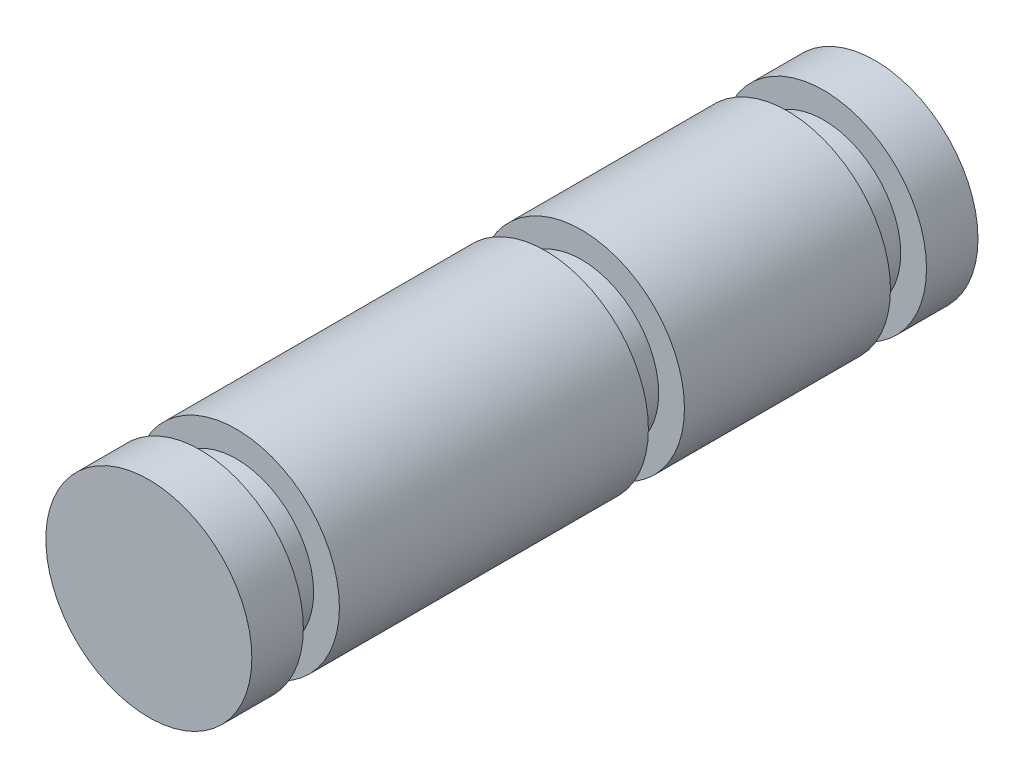
ISO-10303-21;
HEADER;
FILE_DESCRIPTION(('STEP AP214'),'2;1');
FILE_NAME('part.step','',(''),(''),'','','');
FILE_SCHEMA(('AUTOMOTIVE_DESIGN { 1 0 10303 214 1 1 1 1 }'));
ENDSEC;
DATA;
#1=APPLICATION_CONTEXT('core data for automotive mechanical design processes');
#2=APPLICATION_PROTOCOL_DEFINITION('international standard','automotive_design',2000,#1);
#3=PRODUCT_CONTEXT('',#1,'mechanical');
#4=PRODUCT('Part','Part','',(#3));
#5=PRODUCT_RELATED_PRODUCT_CATEGORY('part','',(#4));
#6=PRODUCT_DEFINITION_FORMATION('','',#4);
#7=PRODUCT_DEFINITION_CONTEXT('part definition',#1,'design');
#8=PRODUCT_DEFINITION('design','',#6,#7);
#9=PRODUCT_DEFINITION_SHAPE('','',#8);
#10=(LENGTH_UNIT() NAMED_UNIT(*) SI_UNIT(.MILLI.,.METRE.));
#11=(NAMED_UNIT(*) PLANE_ANGLE_UNIT() SI_UNIT($,.RADIAN.));
#12=(NAMED_UNIT(*) SI_UNIT($,.STERADIAN.) SOLID_ANGLE_UNIT());
#13=UNCERTAINTY_MEASURE_WITH_UNIT(LENGTH_MEASURE(1.E-05),#10,'distance_accuracy_value','');
#14=(GEOMETRIC_REPRESENTATION_CONTEXT(3) GLOBAL_UNCERTAINTY_ASSIGNED_CONTEXT((#13)) GLOBAL_UNIT_ASSIGNED_CONTEXT((#10,
#11,#12)) REPRESENTATION_CONTEXT('',''));
#15=CARTESIAN_POINT('',(0.,0.,0.));
#16=DIRECTION('',(0.,0.,1.));
#17=DIRECTION('',(1.,0.,0.));
#18=AXIS2_PLACEMENT_3D('',#15,#16,#17);
#19=CARTESIAN_POINT('',(0.,0.,12.4));
#20=DIRECTION('',(0.,0.,1.));
#21=DIRECTION('',(1.,0.,0.));
#22=AXIS2_PLACEMENT_3D('',#19,#20,#21);
#23=PLANE('',#22);
#24=CARTESIAN_POINT('',(0.,0.,12.4));
#25=DIRECTION('',(0.,0.,1.));
#26=DIRECTION('',(1.,0.,0.));
#27=AXIS2_PLACEMENT_3D('',#24,#25,#26);
#28=CIRCLE('',#27,2.);
#29=CARTESIAN_POINT('',(2.,0.,12.4));
#30=VERTEX_POINT('',#29);
#31=EDGE_CURVE('E60',#30,#30,#28,.T.);
#32=ORIENTED_EDGE('',*,*,#31,.T.);
#33=EDGE_LOOP('',(#32));
#34=FACE_BOUND('',#33,.T.);
#35=CARTESIAN_POINT('',(0.,0.,12.4));
#36=DIRECTION('',(0.,0.,1.));
#37=DIRECTION('',(1.,0.,0.));
#38=AXIS2_PLACEMENT_3D('',#35,#36,#37);
#39=CIRCLE('',#38,1.5);
#40=CARTESIAN_POINT('',(1.5,0.,12.4));
#41=VERTEX_POINT('',#40);
#42=EDGE_CURVE('E69',#41,#41,#39,.T.);
#43=ORIENTED_EDGE('',*,*,#42,.F.);
#44=EDGE_LOOP('',(#43));
#45=FACE_BOUND('',#44,.T.);
#46=ADVANCED_FACE('F32',(#34,#45),#23,.T.);
#47=CARTESIAN_POINT('',(0.,0.,5.7));
#48=DIRECTION('',(0.,0.,1.));
#49=DIRECTION('',(1.,0.,0.));
#50=AXIS2_PLACEMENT_3D('',#47,#48,#49);
#51=PLANE('',#50);
#52=CARTESIAN_POINT('',(0.,0.,5.7));
#53=DIRECTION('',(0.,0.,1.));
#54=DIRECTION('',(1.,0.,0.));
#55=AXIS2_PLACEMENT_3D('',#52,#53,#54);
#56=CIRCLE('',#55,2.);
#57=CARTESIAN_POINT('',(2.,0.,5.7));
#58=VERTEX_POINT('',#57);
#59=EDGE_CURVE('E48',#58,#58,#56,.T.);
#60=ORIENTED_EDGE('',*,*,#59,.T.);
#61=EDGE_LOOP('',(#60));
#62=FACE_BOUND('',#61,.T.);
#63=CARTESIAN_POINT('',(0.,0.,5.7));
#64=DIRECTION('',(0.,0.,1.));
#65=DIRECTION('',(1.,0.,0.));
#66=AXIS2_PLACEMENT_3D('',#63,#64,#65);
#67=CIRCLE('',#66,1.5);
#68=CARTESIAN_POINT('',(1.5,0.,5.7));
#69=VERTEX_POINT('',#68);
#70=EDGE_CURVE('E57',#69,#69,#67,.T.);
#71=ORIENTED_EDGE('',*,*,#70,.F.);
#72=EDGE_LOOP('',(#71));
#73=FACE_BOUND('',#72,.T.);
#74=ADVANCED_FACE('F103',(#62,#73),#51,.T.);
#75=CARTESIAN_POINT('',(0.,0.,1.));
#76=DIRECTION('',(0.,0.,1.));
#77=DIRECTION('',(1.,0.,0.));
#78=AXIS2_PLACEMENT_3D('',#75,#76,#77);
#79=PLANE('',#78);
#80=CARTESIAN_POINT('',(0.,0.,1.));
#81=DIRECTION('',(0.,0.,1.));
#82=DIRECTION('',(1.,0.,0.));
#83=AXIS2_PLACEMENT_3D('',#80,#81,#82);
#84=CIRCLE('',#83,2.);
#85=CARTESIAN_POINT('',(2.,0.,1.));
#86=VERTEX_POINT('',#85);
#87=EDGE_CURVE('E10',#86,#86,#84,.T.);
#88=ORIENTED_EDGE('',*,*,#87,.T.);
#89=EDGE_LOOP('',(#88));
#90=FACE_BOUND('',#89,.T.);
#91=CARTESIAN_POINT('',(0.,0.,1.));
#92=DIRECTION('',(0.,0.,1.));
#93=DIRECTION('',(1.,0.,0.));
#94=AXIS2_PLACEMENT_3D('',#91,#92,#93);
#95=CIRCLE('',#94,1.5);
#96=CARTESIAN_POINT('',(1.5,0.,1.));
#97=VERTEX_POINT('',#96);
#98=EDGE_CURVE('E45',#97,#97,#95,.T.);
#99=ORIENTED_EDGE('',*,*,#98,.F.);
#100=EDGE_LOOP('',(#99));
#101=FACE_BOUND('',#100,.T.);
#102=ADVANCED_FACE('F109',(#90,#101),#79,.T.);
#103=CARTESIAN_POINT('',(0.,0.,1.));
#104=DIRECTION('',(0.,0.,-1.));
#105=DIRECTION('',(-1.,0.,0.));
#106=AXIS2_PLACEMENT_3D('',#103,#104,#105);
#107=CYLINDRICAL_SURFACE('',#106,2.);
#108=ORIENTED_EDGE('',*,*,#87,.F.);
#109=EDGE_LOOP('',(#108));
#110=FACE_BOUND('',#109,.T.);
#111=CARTESIAN_POINT('',(0.,0.,0.));
#112=DIRECTION('',(0.,0.,1.));
#113=DIRECTION('',(1.,0.,0.));
#114=AXIS2_PLACEMENT_3D('',#111,#112,#113);
#115=CIRCLE('',#114,2.);
#116=CARTESIAN_POINT('',(2.,0.,0.));
#117=VERTEX_POINT('',#116);
#118=EDGE_CURVE('E36',#117,#117,#115,.T.);
#119=ORIENTED_EDGE('',*,*,#118,.T.);
#120=EDGE_LOOP('',(#119));
#121=FACE_BOUND('',#120,.T.);
#122=ADVANCED_FACE('F34',(#110,#121),#107,.T.);
#123=CARTESIAN_POINT('',(0.,0.,0.));
#124=DIRECTION('',(0.,0.,1.));
#125=DIRECTION('',(1.,0.,0.));
#126=AXIS2_PLACEMENT_3D('',#123,#124,#125);
#127=PLANE('',#126);
#128=ORIENTED_EDGE('',*,*,#118,.F.);
#129=EDGE_LOOP('',(#128));
#130=FACE_BOUND('',#129,.T.);
#131=ADVANCED_FACE('F135',(#130),#127,.F.);
#132=CARTESIAN_POINT('',(0.,0.,1.7));
#133=DIRECTION('',(0.,0.,-1.));
#134=DIRECTION('',(-1.,0.,0.));
#135=AXIS2_PLACEMENT_3D('',#132,#133,#134);
#136=CYLINDRICAL_SURFACE('',#135,1.5);
#137=CARTESIAN_POINT('',(0.,0.,1.7));
#138=DIRECTION('',(0.,0.,1.));
#139=DIRECTION('',(1.,0.,0.));
#140=AXIS2_PLACEMENT_3D('',#137,#138,#139);
#141=CIRCLE('',#140,1.5);
#142=CARTESIAN_POINT('',(1.5,0.,1.7));
#143=VERTEX_POINT('',#142);
#144=EDGE_CURVE('E43',#143,#143,#141,.T.);
#145=ORIENTED_EDGE('',*,*,#144,.F.);
#146=EDGE_LOOP('',(#145));
#147=FACE_BOUND('',#146,.T.);
#148=ORIENTED_EDGE('',*,*,#98,.T.);
#149=EDGE_LOOP('',(#148));
#150=FACE_BOUND('',#149,.T.);
#151=ADVANCED_FACE('F128',(#147,#150),#136,.T.);
#152=CARTESIAN_POINT('',(0.,0.,1.7));
#153=DIRECTION('',(0.,0.,1.));
#154=DIRECTION('',(1.,0.,0.));
#155=AXIS2_PLACEMENT_3D('',#152,#153,#154);
#156=PLANE('',#155);
#157=CARTESIAN_POINT('',(0.,0.,1.7));
#158=DIRECTION('',(0.,0.,1.));
#159=DIRECTION('',(1.,0.,0.));
#160=AXIS2_PLACEMENT_3D('',#157,#158,#159);
#161=CIRCLE('',#160,2.);
#162=CARTESIAN_POINT('',(2.,0.,1.7));
#163=VERTEX_POINT('',#162);
#164=EDGE_CURVE('E51',#163,#163,#161,.T.);
#165=ORIENTED_EDGE('',*,*,#164,.F.);
#166=EDGE_LOOP('',(#165));
#167=FACE_BOUND('',#166,.T.);
#168=ORIENTED_EDGE('',*,*,#144,.T.);
#169=EDGE_LOOP('',(#168));
#170=FACE_BOUND('',#169,.T.);
#171=ADVANCED_FACE('F125',(#167,#170),#156,.F.);
#172=CARTESIAN_POINT('',(0.,0.,5.7));
#173=DIRECTION('',(0.,0.,-1.));
#174=DIRECTION('',(-1.,0.,0.));
#175=AXIS2_PLACEMENT_3D('',#172,#173,#174);
#176=CYLINDRICAL_SURFACE('',#175,2.);
#177=ORIENTED_EDGE('',*,*,#59,.F.);
#178=EDGE_LOOP('',(#177));
#179=FACE_BOUND('',#178,.T.);
#180=ORIENTED_EDGE('',*,*,#164,.T.);
#181=EDGE_LOOP('',(#180));
#182=FACE_BOUND('',#181,.T.);
#183=ADVANCED_FACE('F122',(#179,#182),#176,.T.);
#184=CARTESIAN_POINT('',(0.,0.,6.4));
#185=DIRECTION('',(0.,0.,-1.));
#186=DIRECTION('',(-1.,0.,0.));
#187=AXIS2_PLACEMENT_3D('',#184,#185,#186);
#188=CYLINDRICAL_SURFACE('',#187,1.5);
#189=CARTESIAN_POINT('',(0.,0.,6.4));
#190=DIRECTION('',(0.,0.,1.));
#191=DIRECTION('',(1.,0.,0.));
#192=AXIS2_PLACEMENT_3D('',#189,#190,#191);
#193=CIRCLE('',#192,1.5);
#194=CARTESIAN_POINT('',(1.5,0.,6.4));
#195=VERTEX_POINT('',#194);
#196=EDGE_CURVE('E54',#195,#195,#193,.T.);
#197=ORIENTED_EDGE('',*,*,#196,.F.);
#198=EDGE_LOOP('',(#197));
#199=FACE_BOUND('',#198,.T.);
#200=ORIENTED_EDGE('',*,*,#70,.T.);
#201=EDGE_LOOP('',(#200));
#202=FACE_BOUND('',#201,.T.);
#203=ADVANCED_FACE('F116',(#199,#202),#188,.T.);
#204=CARTESIAN_POINT('',(0.,0.,6.4));
#205=DIRECTION('',(0.,0.,1.));
#206=DIRECTION('',(1.,0.,0.));
#207=AXIS2_PLACEMENT_3D('',#204,#205,#206);
#208=PLANE('',#207);
#209=CARTESIAN_POINT('',(0.,0.,6.4));
#210=DIRECTION('',(0.,0.,1.));
#211=DIRECTION('',(1.,0.,0.));
#212=AXIS2_PLACEMENT_3D('',#209,#210,#211);
#213=CIRCLE('',#212,2.);
#214=CARTESIAN_POINT('',(2.,0.,6.4));
#215=VERTEX_POINT('',#214);
#216=EDGE_CURVE('E63',#215,#215,#213,.T.);
#217=ORIENTED_EDGE('',*,*,#216,.F.);
#218=EDGE_LOOP('',(#217));
#219=FACE_BOUND('',#218,.T.);
#220=ORIENTED_EDGE('',*,*,#196,.T.);
#221=EDGE_LOOP('',(#220));
#222=FACE_BOUND('',#221,.T.);
#223=ADVANCED_FACE('F113',(#219,#222),#208,.F.);
#224=CARTESIAN_POINT('',(0.,0.,12.4));
#225=DIRECTION('',(0.,0.,-1.));
#226=DIRECTION('',(-1.,0.,0.));
#227=AXIS2_PLACEMENT_3D('',#224,#225,#226);
#228=CYLINDRICAL_SURFACE('',#227,2.);
#229=ORIENTED_EDGE('',*,*,#31,.F.);
#230=EDGE_LOOP('',(#229));
#231=FACE_BOUND('',#230,.T.);
#232=ORIENTED_EDGE('',*,*,#216,.T.);
#233=EDGE_LOOP('',(#232));
#234=FACE_BOUND('',#233,.T.);
#235=ADVANCED_FACE('F98',(#231,#234),#228,.T.);
#236=CARTESIAN_POINT('',(0.,0.,13.1));
#237=DIRECTION('',(0.,0.,-1.));
#238=DIRECTION('',(-1.,0.,0.));
#239=AXIS2_PLACEMENT_3D('',#236,#237,#238);
#240=CYLINDRICAL_SURFACE('',#239,1.5);
#241=CARTESIAN_POINT('',(0.,0.,13.1));
#242=DIRECTION('',(0.,0.,1.));
#243=DIRECTION('',(1.,0.,0.));
#244=AXIS2_PLACEMENT_3D('',#241,#242,#243);
#245=CIRCLE('',#244,1.5);
#246=CARTESIAN_POINT('',(1.5,0.,13.1));
#247=VERTEX_POINT('',#246);
#248=EDGE_CURVE('E66',#247,#247,#245,.T.);
#249=ORIENTED_EDGE('',*,*,#248,.F.);
#250=EDGE_LOOP('',(#249));
#251=FACE_BOUND('',#250,.T.);
#252=ORIENTED_EDGE('',*,*,#42,.T.);
#253=EDGE_LOOP('',(#252));
#254=FACE_BOUND('',#253,.T.);
#255=ADVANCED_FACE('F92',(#251,#254),#240,.T.);
#256=CARTESIAN_POINT('',(0.,0.,13.1));
#257=DIRECTION('',(0.,0.,1.));
#258=DIRECTION('',(1.,0.,0.));
#259=AXIS2_PLACEMENT_3D('',#256,#257,#258);
#260=PLANE('',#259);
#261=CARTESIAN_POINT('',(0.,0.,13.1));
#262=DIRECTION('',(0.,0.,1.));
#263=DIRECTION('',(1.,0.,0.));
#264=AXIS2_PLACEMENT_3D('',#261,#262,#263);
#265=CIRCLE('',#264,2.);
#266=CARTESIAN_POINT('',(2.,0.,13.1));
#267=VERTEX_POINT('',#266);
#268=EDGE_CURVE('E75',#267,#267,#265,.T.);
#269=ORIENTED_EDGE('',*,*,#268,.F.);
#270=EDGE_LOOP('',(#269));
#271=FACE_BOUND('',#270,.T.);
#272=ORIENTED_EDGE('',*,*,#248,.T.);
#273=EDGE_LOOP('',(#272));
#274=FACE_BOUND('',#273,.T.);
#275=ADVANCED_FACE('F86',(#271,#274),#260,.F.);
#276=CARTESIAN_POINT('',(0.,0.,14.1));
#277=DIRECTION('',(0.,0.,-1.));
#278=DIRECTION('',(-1.,0.,0.));
#279=AXIS2_PLACEMENT_3D('',#276,#277,#278);
#280=CYLINDRICAL_SURFACE('',#279,2.);
#281=CARTESIAN_POINT('',(0.,0.,14.1));
#282=DIRECTION('',(0.,0.,1.));
#283=DIRECTION('',(1.,0.,0.));
#284=AXIS2_PLACEMENT_3D('',#281,#282,#283);
#285=CIRCLE('',#284,2.);
#286=CARTESIAN_POINT('',(2.,0.,14.1));
#287=VERTEX_POINT('',#286);
#288=EDGE_CURVE('E72',#287,#287,#285,.T.);
#289=ORIENTED_EDGE('',*,*,#288,.F.);
#290=EDGE_LOOP('',(#289));
#291=FACE_BOUND('',#290,.T.);
#292=ORIENTED_EDGE('',*,*,#268,.T.);
#293=EDGE_LOOP('',(#292));
#294=FACE_BOUND('',#293,.T.);
#295=ADVANCED_FACE('F83',(#291,#294),#280,.T.);
#296=CARTESIAN_POINT('',(0.,0.,14.1));
#297=DIRECTION('',(0.,0.,1.));
#298=DIRECTION('',(1.,0.,0.));
#299=AXIS2_PLACEMENT_3D('',#296,#297,#298);
#300=PLANE('',#299);
#301=ORIENTED_EDGE('',*,*,#288,.T.);
#302=EDGE_LOOP('',(#301));
#303=FACE_BOUND('',#302,.T.);
#304=ADVANCED_FACE('F81',(#303),#300,.T.);
#305=CLOSED_SHELL('',(#46,#74,#102,#122,#131,#151,#171,#183,#203,#223,#235,#255,#275,#295,#304));
#306=MANIFOLD_SOLID_BREP('B2',#305);
#307=ADVANCED_BREP_SHAPE_REPRESENTATION('',(#18,#306),#14);
#308=SHAPE_DEFINITION_REPRESENTATION(#9,#307);
ENDSEC;
END-ISO-10303-21;
